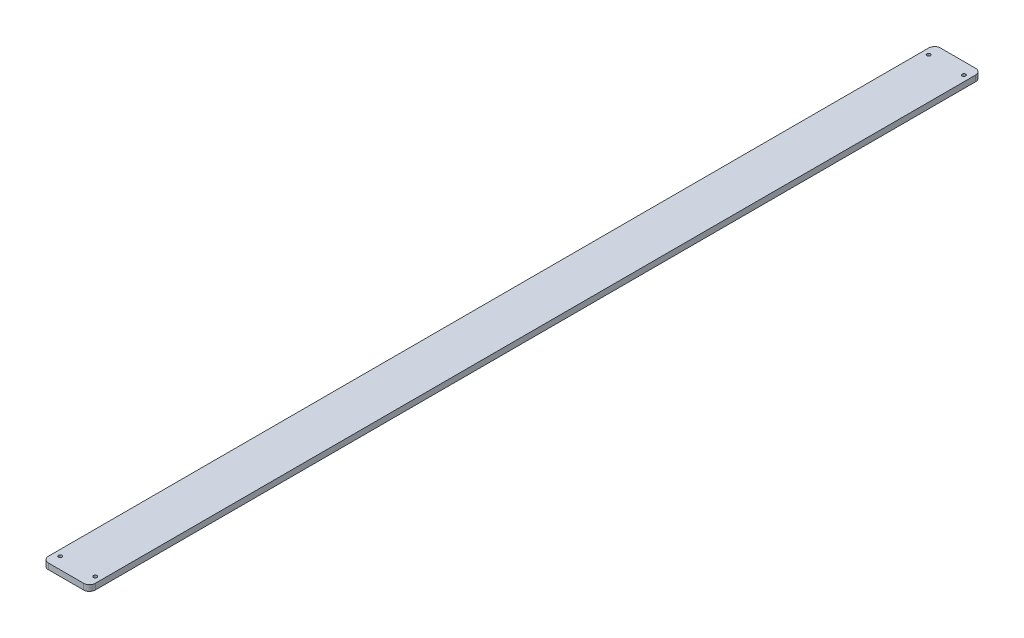
ISO-10303-21;
HEADER;
FILE_DESCRIPTION(('STEP AP214'),'2;1');
FILE_NAME('part.step','',(''),(''),'','','');
FILE_SCHEMA(('AUTOMOTIVE_DESIGN { 1 0 10303 214 1 1 1 1 }'));
ENDSEC;
DATA;
#1=APPLICATION_CONTEXT('core data for automotive mechanical design processes');
#2=APPLICATION_PROTOCOL_DEFINITION('international standard','automotive_design',2000,#1);
#3=PRODUCT_CONTEXT('',#1,'mechanical');
#4=PRODUCT('Part','Part','',(#3));
#5=PRODUCT_RELATED_PRODUCT_CATEGORY('part','',(#4));
#6=PRODUCT_DEFINITION_FORMATION('','',#4);
#7=PRODUCT_DEFINITION_CONTEXT('part definition',#1,'design');
#8=PRODUCT_DEFINITION('design','',#6,#7);
#9=PRODUCT_DEFINITION_SHAPE('','',#8);
#10=(LENGTH_UNIT() NAMED_UNIT(*) SI_UNIT(.MILLI.,.METRE.));
#11=(NAMED_UNIT(*) PLANE_ANGLE_UNIT() SI_UNIT($,.RADIAN.));
#12=(NAMED_UNIT(*) SI_UNIT($,.STERADIAN.) SOLID_ANGLE_UNIT());
#13=UNCERTAINTY_MEASURE_WITH_UNIT(LENGTH_MEASURE(1.E-05),#10,'distance_accuracy_value','');
#14=(GEOMETRIC_REPRESENTATION_CONTEXT(3) GLOBAL_UNCERTAINTY_ASSIGNED_CONTEXT((#13)) GLOBAL_UNIT_ASSIGNED_CONTEXT((#10,
#11,#12)) REPRESENTATION_CONTEXT('',''));
#15=CARTESIAN_POINT('',(0.,0.,0.));
#16=DIRECTION('',(0.,0.,1.));
#17=DIRECTION('',(1.,0.,0.));
#18=AXIS2_PLACEMENT_3D('',#15,#16,#17);
#19=CARTESIAN_POINT('',(0.,5.,0.));
#20=DIRECTION('',(0.,-1.,0.));
#21=DIRECTION('',(0.,0.,-1.));
#22=AXIS2_PLACEMENT_3D('',#19,#20,#21);
#23=PLANE('',#22);
#24=DIRECTION('',(-1.,0.,0.));
#25=VECTOR('',#24,1.);
#26=CARTESIAN_POINT('',(-20.,5.,-380.5));
#27=LINE('',#26,#25);
#28=CARTESIAN_POINT('',(15.,5.,-380.5));
#29=VERTEX_POINT('',#28);
#30=CARTESIAN_POINT('',(-15.,5.,-380.5));
#31=VERTEX_POINT('',#30);
#32=EDGE_CURVE('E170',#29,#31,#27,.T.);
#33=ORIENTED_EDGE('',*,*,#32,.T.);
#34=CARTESIAN_POINT('',(-15.,5.,-375.5));
#35=DIRECTION('',(0.,-1.,0.));
#36=DIRECTION('',(0.,0.,-1.));
#37=AXIS2_PLACEMENT_3D('',#34,#35,#36);
#38=CIRCLE('',#37,5.);
#39=CARTESIAN_POINT('',(-20.,5.,-375.5));
#40=VERTEX_POINT('',#39);
#41=EDGE_CURVE('E150',#31,#40,#38,.F.);
#42=ORIENTED_EDGE('',*,*,#41,.T.);
#43=DIRECTION('',(0.,0.,1.));
#44=VECTOR('',#43,1.);
#45=CARTESIAN_POINT('',(-19.9999999999998,5.,380.5));
#46=LINE('',#45,#44);
#47=CARTESIAN_POINT('',(-19.9999999999998,5.,375.5));
#48=VERTEX_POINT('',#47);
#49=EDGE_CURVE('E120',#40,#48,#46,.T.);
#50=ORIENTED_EDGE('',*,*,#49,.T.);
#51=CARTESIAN_POINT('',(-14.9999999999998,5.,375.5));
#52=DIRECTION('',(0.,-1.,0.));
#53=DIRECTION('',(0.,0.,-1.));
#54=AXIS2_PLACEMENT_3D('',#51,#52,#53);
#55=CIRCLE('',#54,5.);
#56=CARTESIAN_POINT('',(-14.9999999999998,5.,380.5));
#57=VERTEX_POINT('',#56);
#58=EDGE_CURVE('E56',#48,#57,#55,.F.);
#59=ORIENTED_EDGE('',*,*,#58,.T.);
#60=DIRECTION('',(1.,0.,0.));
#61=VECTOR('',#60,1.);
#62=CARTESIAN_POINT('',(-19.9999999999998,5.,380.5));
#63=LINE('',#62,#61);
#64=CARTESIAN_POINT('',(15.,5.,380.5));
#65=VERTEX_POINT('',#64);
#66=EDGE_CURVE('E137',#57,#65,#63,.T.);
#67=ORIENTED_EDGE('',*,*,#66,.T.);
#68=CARTESIAN_POINT('',(15.,5.,375.5));
#69=DIRECTION('',(0.,-1.,0.));
#70=DIRECTION('',(0.,0.,-1.));
#71=AXIS2_PLACEMENT_3D('',#68,#69,#70);
#72=CIRCLE('',#71,5.);
#73=CARTESIAN_POINT('',(20.,5.,375.5));
#74=VERTEX_POINT('',#73);
#75=EDGE_CURVE('E145',#65,#74,#72,.F.);
#76=ORIENTED_EDGE('',*,*,#75,.T.);
#77=DIRECTION('',(0.,0.,-1.));
#78=VECTOR('',#77,1.);
#79=CARTESIAN_POINT('',(20.,5.,380.5));
#80=LINE('',#79,#78);
#81=CARTESIAN_POINT('',(20.,5.,-375.5));
#82=VERTEX_POINT('',#81);
#83=EDGE_CURVE('E131',#74,#82,#80,.T.);
#84=ORIENTED_EDGE('',*,*,#83,.T.);
#85=CARTESIAN_POINT('',(15.,5.,-375.5));
#86=DIRECTION('',(0.,-1.,0.));
#87=DIRECTION('',(0.,0.,-1.));
#88=AXIS2_PLACEMENT_3D('',#85,#86,#87);
#89=CIRCLE('',#88,5.);
#90=EDGE_CURVE('E148',#82,#29,#89,.F.);
#91=ORIENTED_EDGE('',*,*,#90,.T.);
#92=EDGE_LOOP('',(#33,#42,#50,#59,#67,#76,#84,#91));
#93=FACE_BOUND('',#92,.T.);
#94=CARTESIAN_POINT('',(15.,5.,-370.5));
#95=DIRECTION('',(0.,1.,0.));
#96=DIRECTION('',(0.,0.,1.));
#97=AXIS2_PLACEMENT_3D('',#94,#95,#96);
#98=CIRCLE('',#97,1.5);
#99=CARTESIAN_POINT('',(15.,5.,-369.));
#100=VERTEX_POINT('',#99);
#101=EDGE_CURVE('E176',#100,#100,#98,.T.);
#102=ORIENTED_EDGE('',*,*,#101,.F.);
#103=EDGE_LOOP('',(#102));
#104=FACE_BOUND('',#103,.T.);
#105=CARTESIAN_POINT('',(-15.,5.,-370.5));
#106=DIRECTION('',(0.,1.,0.));
#107=DIRECTION('',(0.,0.,-1.));
#108=AXIS2_PLACEMENT_3D('',#105,#106,#107);
#109=CIRCLE('',#108,1.5);
#110=CARTESIAN_POINT('',(-15.,5.,-372.));
#111=VERTEX_POINT('',#110);
#112=EDGE_CURVE('E185',#111,#111,#109,.T.);
#113=ORIENTED_EDGE('',*,*,#112,.F.);
#114=EDGE_LOOP('',(#113));
#115=FACE_BOUND('',#114,.T.);
#116=CARTESIAN_POINT('',(-15.,5.,370.5));
#117=DIRECTION('',(0.,1.,0.));
#118=DIRECTION('',(0.,0.,1.));
#119=AXIS2_PLACEMENT_3D('',#116,#117,#118);
#120=CIRCLE('',#119,1.5);
#121=CARTESIAN_POINT('',(-15.,5.,372.));
#122=VERTEX_POINT('',#121);
#123=EDGE_CURVE('E190',#122,#122,#120,.T.);
#124=ORIENTED_EDGE('',*,*,#123,.F.);
#125=EDGE_LOOP('',(#124));
#126=FACE_BOUND('',#125,.T.);
#127=CARTESIAN_POINT('',(15.,5.,370.5));
#128=DIRECTION('',(0.,1.,0.));
#129=DIRECTION('',(0.,0.,-1.));
#130=AXIS2_PLACEMENT_3D('',#127,#128,#129);
#131=CIRCLE('',#130,1.5);
#132=CARTESIAN_POINT('',(15.,5.,369.));
#133=VERTEX_POINT('',#132);
#134=EDGE_CURVE('E196',#133,#133,#131,.T.);
#135=ORIENTED_EDGE('',*,*,#134,.F.);
#136=EDGE_LOOP('',(#135));
#137=FACE_BOUND('',#136,.T.);
#138=ADVANCED_FACE('F35',(#93,#104,#115,#126,#137),#23,.F.);
#139=CARTESIAN_POINT('',(0.,0.,0.));
#140=DIRECTION('',(0.,-1.,0.));
#141=DIRECTION('',(0.,0.,-1.));
#142=AXIS2_PLACEMENT_3D('',#139,#140,#141);
#143=PLANE('',#142);
#144=CARTESIAN_POINT('',(-15.,0.,370.5));
#145=DIRECTION('',(0.,1.,0.));
#146=DIRECTION('',(0.,0.,1.));
#147=AXIS2_PLACEMENT_3D('',#144,#145,#146);
#148=CIRCLE('',#147,1.5);
#149=CARTESIAN_POINT('',(-15.,0.,372.));
#150=VERTEX_POINT('',#149);
#151=EDGE_CURVE('E193',#150,#150,#148,.T.);
#152=ORIENTED_EDGE('',*,*,#151,.T.);
#153=EDGE_LOOP('',(#152));
#154=FACE_BOUND('',#153,.T.);
#155=CARTESIAN_POINT('',(15.,0.,-370.5));
#156=DIRECTION('',(0.,1.,0.));
#157=DIRECTION('',(0.,0.,1.));
#158=AXIS2_PLACEMENT_3D('',#155,#156,#157);
#159=CIRCLE('',#158,1.5);
#160=CARTESIAN_POINT('',(15.,0.,-369.));
#161=VERTEX_POINT('',#160);
#162=EDGE_CURVE('E178',#161,#161,#159,.T.);
#163=ORIENTED_EDGE('',*,*,#162,.T.);
#164=EDGE_LOOP('',(#163));
#165=FACE_BOUND('',#164,.T.);
#166=DIRECTION('',(0.,0.,1.));
#167=VECTOR('',#166,1.);
#168=CARTESIAN_POINT('',(-19.9999999999998,0.,380.5));
#169=LINE('',#168,#167);
#170=CARTESIAN_POINT('',(-20.,0.,-375.5));
#171=VERTEX_POINT('',#170);
#172=CARTESIAN_POINT('',(-19.9999999999998,0.,375.5));
#173=VERTEX_POINT('',#172);
#174=EDGE_CURVE('E118',#171,#173,#169,.T.);
#175=ORIENTED_EDGE('',*,*,#174,.F.);
#176=CARTESIAN_POINT('',(-15.,0.,-375.5));
#177=DIRECTION('',(0.,-1.,0.));
#178=DIRECTION('',(0.,0.,-1.));
#179=AXIS2_PLACEMENT_3D('',#176,#177,#178);
#180=CIRCLE('',#179,5.);
#181=CARTESIAN_POINT('',(-15.,0.,-380.5));
#182=VERTEX_POINT('',#181);
#183=EDGE_CURVE('E101',#171,#182,#180,.T.);
#184=ORIENTED_EDGE('',*,*,#183,.T.);
#185=DIRECTION('',(-1.,0.,0.));
#186=VECTOR('',#185,1.);
#187=CARTESIAN_POINT('',(-20.,0.,-380.5));
#188=LINE('',#187,#186);
#189=CARTESIAN_POINT('',(15.,0.,-380.5));
#190=VERTEX_POINT('',#189);
#191=EDGE_CURVE('E129',#190,#182,#188,.T.);
#192=ORIENTED_EDGE('',*,*,#191,.F.);
#193=CARTESIAN_POINT('',(15.,0.,-375.5));
#194=DIRECTION('',(0.,-1.,0.));
#195=DIRECTION('',(0.,0.,-1.));
#196=AXIS2_PLACEMENT_3D('',#193,#194,#195);
#197=CIRCLE('',#196,5.);
#198=CARTESIAN_POINT('',(20.,0.,-375.5));
#199=VERTEX_POINT('',#198);
#200=EDGE_CURVE('E112',#190,#199,#197,.T.);
#201=ORIENTED_EDGE('',*,*,#200,.T.);
#202=DIRECTION('',(0.,0.,-1.));
#203=VECTOR('',#202,1.);
#204=CARTESIAN_POINT('',(20.,0.,380.5));
#205=LINE('',#204,#203);
#206=CARTESIAN_POINT('',(20.,0.,375.5));
#207=VERTEX_POINT('',#206);
#208=EDGE_CURVE('E133',#207,#199,#205,.T.);
#209=ORIENTED_EDGE('',*,*,#208,.F.);
#210=CARTESIAN_POINT('',(15.,0.,375.5));
#211=DIRECTION('',(0.,-1.,0.));
#212=DIRECTION('',(0.,0.,-1.));
#213=AXIS2_PLACEMENT_3D('',#210,#211,#212);
#214=CIRCLE('',#213,5.);
#215=CARTESIAN_POINT('',(15.,0.,380.5));
#216=VERTEX_POINT('',#215);
#217=EDGE_CURVE('E121',#207,#216,#214,.T.);
#218=ORIENTED_EDGE('',*,*,#217,.T.);
#219=DIRECTION('',(1.,0.,0.));
#220=VECTOR('',#219,1.);
#221=CARTESIAN_POINT('',(-19.9999999999998,0.,380.5));
#222=LINE('',#221,#220);
#223=CARTESIAN_POINT('',(-14.9999999999998,0.,380.5));
#224=VERTEX_POINT('',#223);
#225=EDGE_CURVE('E128',#224,#216,#222,.T.);
#226=ORIENTED_EDGE('',*,*,#225,.F.);
#227=CARTESIAN_POINT('',(-14.9999999999998,0.,375.5));
#228=DIRECTION('',(0.,-1.,0.));
#229=DIRECTION('',(0.,0.,-1.));
#230=AXIS2_PLACEMENT_3D('',#227,#228,#229);
#231=CIRCLE('',#230,5.);
#232=EDGE_CURVE('E127',#224,#173,#231,.T.);
#233=ORIENTED_EDGE('',*,*,#232,.T.);
#234=EDGE_LOOP('',(#175,#184,#192,#201,#209,#218,#226,#233));
#235=FACE_BOUND('',#234,.T.);
#236=CARTESIAN_POINT('',(-15.,0.,-370.5));
#237=DIRECTION('',(0.,1.,0.));
#238=DIRECTION('',(0.,0.,-1.));
#239=AXIS2_PLACEMENT_3D('',#236,#237,#238);
#240=CIRCLE('',#239,1.5);
#241=CARTESIAN_POINT('',(-15.,0.,-372.));
#242=VERTEX_POINT('',#241);
#243=EDGE_CURVE('E187',#242,#242,#240,.T.);
#244=ORIENTED_EDGE('',*,*,#243,.T.);
#245=EDGE_LOOP('',(#244));
#246=FACE_BOUND('',#245,.T.);
#247=CARTESIAN_POINT('',(15.,0.,370.5));
#248=DIRECTION('',(0.,1.,0.));
#249=DIRECTION('',(0.,0.,-1.));
#250=AXIS2_PLACEMENT_3D('',#247,#248,#249);
#251=CIRCLE('',#250,1.5);
#252=CARTESIAN_POINT('',(15.,0.,369.));
#253=VERTEX_POINT('',#252);
#254=EDGE_CURVE('E199',#253,#253,#251,.T.);
#255=ORIENTED_EDGE('',*,*,#254,.T.);
#256=EDGE_LOOP('',(#255));
#257=FACE_BOUND('',#256,.T.);
#258=ADVANCED_FACE('F124',(#154,#165,#235,#246,#257),#143,.T.);
#259=CARTESIAN_POINT('',(20.,5.,380.5));
#260=DIRECTION('',(-1.,0.,0.));
#261=DIRECTION('',(0.,0.,1.));
#262=AXIS2_PLACEMENT_3D('',#259,#260,#261);
#263=PLANE('',#262);
#264=ORIENTED_EDGE('',*,*,#208,.T.);
#265=DIRECTION('',(0.,-1.,0.));
#266=VECTOR('',#265,1.);
#267=CARTESIAN_POINT('',(20.,5.,-375.5));
#268=LINE('',#267,#266);
#269=EDGE_CURVE('E155',#199,#82,#268,.F.);
#270=ORIENTED_EDGE('',*,*,#269,.T.);
#271=ORIENTED_EDGE('',*,*,#83,.F.);
#272=DIRECTION('',(0.,-1.,0.));
#273=VECTOR('',#272,1.);
#274=CARTESIAN_POINT('',(20.,5.,375.5));
#275=LINE('',#274,#273);
#276=EDGE_CURVE('E152',#74,#207,#275,.T.);
#277=ORIENTED_EDGE('',*,*,#276,.T.);
#278=EDGE_LOOP('',(#264,#270,#271,#277));
#279=FACE_BOUND('',#278,.T.);
#280=ADVANCED_FACE('F161',(#279),#263,.F.);
#281=CARTESIAN_POINT('',(-20.,5.,-380.5));
#282=DIRECTION('',(0.,0.,1.));
#283=DIRECTION('',(1.,0.,0.));
#284=AXIS2_PLACEMENT_3D('',#281,#282,#283);
#285=PLANE('',#284);
#286=ORIENTED_EDGE('',*,*,#191,.T.);
#287=DIRECTION('',(0.,-1.,0.));
#288=VECTOR('',#287,1.);
#289=CARTESIAN_POINT('',(-15.,5.,-380.5));
#290=LINE('',#289,#288);
#291=EDGE_CURVE('E106',#182,#31,#290,.F.);
#292=ORIENTED_EDGE('',*,*,#291,.T.);
#293=ORIENTED_EDGE('',*,*,#32,.F.);
#294=DIRECTION('',(0.,-1.,0.));
#295=VECTOR('',#294,1.);
#296=CARTESIAN_POINT('',(15.,5.,-380.5));
#297=LINE('',#296,#295);
#298=EDGE_CURVE('E111',#29,#190,#297,.T.);
#299=ORIENTED_EDGE('',*,*,#298,.T.);
#300=EDGE_LOOP('',(#286,#292,#293,#299));
#301=FACE_BOUND('',#300,.T.);
#302=ADVANCED_FACE('F175',(#301),#285,.F.);
#303=CARTESIAN_POINT('',(-19.9999999999998,5.,380.5));
#304=DIRECTION('',(1.,0.,0.));
#305=DIRECTION('',(0.,0.,-1.));
#306=AXIS2_PLACEMENT_3D('',#303,#304,#305);
#307=PLANE('',#306);
#308=ORIENTED_EDGE('',*,*,#49,.F.);
#309=DIRECTION('',(0.,-1.,0.));
#310=VECTOR('',#309,1.);
#311=CARTESIAN_POINT('',(-20.,5.,-375.5));
#312=LINE('',#311,#310);
#313=EDGE_CURVE('E105',#40,#171,#312,.T.);
#314=ORIENTED_EDGE('',*,*,#313,.T.);
#315=ORIENTED_EDGE('',*,*,#174,.T.);
#316=DIRECTION('',(0.,-1.,0.));
#317=VECTOR('',#316,1.);
#318=CARTESIAN_POINT('',(-19.9999999999998,5.,375.5));
#319=LINE('',#318,#317);
#320=EDGE_CURVE('E122',#173,#48,#319,.F.);
#321=ORIENTED_EDGE('',*,*,#320,.T.);
#322=EDGE_LOOP('',(#308,#314,#315,#321));
#323=FACE_BOUND('',#322,.T.);
#324=ADVANCED_FACE('F117',(#323),#307,.F.);
#325=CARTESIAN_POINT('',(-19.9999999999998,5.,380.5));
#326=DIRECTION('',(0.,0.,-1.));
#327=DIRECTION('',(-1.,0.,0.));
#328=AXIS2_PLACEMENT_3D('',#325,#326,#327);
#329=PLANE('',#328);
#330=ORIENTED_EDGE('',*,*,#66,.F.);
#331=DIRECTION('',(0.,-1.,0.));
#332=VECTOR('',#331,1.);
#333=CARTESIAN_POINT('',(-14.9999999999998,5.,380.5));
#334=LINE('',#333,#332);
#335=EDGE_CURVE('E11',#57,#224,#334,.T.);
#336=ORIENTED_EDGE('',*,*,#335,.T.);
#337=ORIENTED_EDGE('',*,*,#225,.T.);
#338=DIRECTION('',(0.,-1.,0.));
#339=VECTOR('',#338,1.);
#340=CARTESIAN_POINT('',(15.,5.,380.5));
#341=LINE('',#340,#339);
#342=EDGE_CURVE('E43',#216,#65,#341,.F.);
#343=ORIENTED_EDGE('',*,*,#342,.T.);
#344=EDGE_LOOP('',(#330,#336,#337,#343));
#345=FACE_BOUND('',#344,.T.);
#346=ADVANCED_FACE('F219',(#345),#329,.F.);
#347=CARTESIAN_POINT('',(15.,5.,-370.5));
#348=DIRECTION('',(0.,-1.,0.));
#349=DIRECTION('',(0.,0.,-1.));
#350=AXIS2_PLACEMENT_3D('',#347,#348,#349);
#351=CYLINDRICAL_SURFACE('',#350,1.5);
#352=ORIENTED_EDGE('',*,*,#101,.T.);
#353=EDGE_LOOP('',(#352));
#354=FACE_BOUND('',#353,.T.);
#355=ORIENTED_EDGE('',*,*,#162,.F.);
#356=EDGE_LOOP('',(#355));
#357=FACE_BOUND('',#356,.T.);
#358=ADVANCED_FACE('F216',(#354,#357),#351,.F.);
#359=CARTESIAN_POINT('',(-15.,5.,-370.5));
#360=DIRECTION('',(0.,-1.,0.));
#361=DIRECTION('',(0.,0.,-1.));
#362=AXIS2_PLACEMENT_3D('',#359,#360,#361);
#363=CYLINDRICAL_SURFACE('',#362,1.5);
#364=ORIENTED_EDGE('',*,*,#112,.T.);
#365=EDGE_LOOP('',(#364));
#366=FACE_BOUND('',#365,.T.);
#367=ORIENTED_EDGE('',*,*,#243,.F.);
#368=EDGE_LOOP('',(#367));
#369=FACE_BOUND('',#368,.T.);
#370=ADVANCED_FACE('F311',(#366,#369),#363,.F.);
#371=CARTESIAN_POINT('',(-15.,5.,370.5));
#372=DIRECTION('',(0.,-1.,0.));
#373=DIRECTION('',(0.,0.,-1.));
#374=AXIS2_PLACEMENT_3D('',#371,#372,#373);
#375=CYLINDRICAL_SURFACE('',#374,1.5);
#376=ORIENTED_EDGE('',*,*,#123,.T.);
#377=EDGE_LOOP('',(#376));
#378=FACE_BOUND('',#377,.T.);
#379=ORIENTED_EDGE('',*,*,#151,.F.);
#380=EDGE_LOOP('',(#379));
#381=FACE_BOUND('',#380,.T.);
#382=ADVANCED_FACE('F302',(#378,#381),#375,.F.);
#383=CARTESIAN_POINT('',(15.,5.,370.5));
#384=DIRECTION('',(0.,-1.,0.));
#385=DIRECTION('',(0.,0.,-1.));
#386=AXIS2_PLACEMENT_3D('',#383,#384,#385);
#387=CYLINDRICAL_SURFACE('',#386,1.5);
#388=ORIENTED_EDGE('',*,*,#134,.T.);
#389=EDGE_LOOP('',(#388));
#390=FACE_BOUND('',#389,.T.);
#391=ORIENTED_EDGE('',*,*,#254,.F.);
#392=EDGE_LOOP('',(#391));
#393=FACE_BOUND('',#392,.T.);
#394=ADVANCED_FACE('F205',(#390,#393),#387,.F.);
#395=CARTESIAN_POINT('',(-15.,5.,-375.5));
#396=DIRECTION('',(0.,-1.,0.));
#397=DIRECTION('',(0.,0.,-1.));
#398=AXIS2_PLACEMENT_3D('',#395,#396,#397);
#399=CYLINDRICAL_SURFACE('',#398,5.);
#400=ORIENTED_EDGE('',*,*,#41,.F.);
#401=ORIENTED_EDGE('',*,*,#291,.F.);
#402=ORIENTED_EDGE('',*,*,#183,.F.);
#403=ORIENTED_EDGE('',*,*,#313,.F.);
#404=EDGE_LOOP('',(#400,#401,#402,#403));
#405=FACE_BOUND('',#404,.T.);
#406=ADVANCED_FACE('F104',(#405),#399,.T.);
#407=CARTESIAN_POINT('',(15.,5.,-375.5));
#408=DIRECTION('',(0.,-1.,0.));
#409=DIRECTION('',(0.,0.,-1.));
#410=AXIS2_PLACEMENT_3D('',#407,#408,#409);
#411=CYLINDRICAL_SURFACE('',#410,5.);
#412=ORIENTED_EDGE('',*,*,#90,.F.);
#413=ORIENTED_EDGE('',*,*,#269,.F.);
#414=ORIENTED_EDGE('',*,*,#200,.F.);
#415=ORIENTED_EDGE('',*,*,#298,.F.);
#416=EDGE_LOOP('',(#412,#413,#414,#415));
#417=FACE_BOUND('',#416,.T.);
#418=ADVANCED_FACE('F173',(#417),#411,.T.);
#419=CARTESIAN_POINT('',(-14.9999999999998,5.,375.5));
#420=DIRECTION('',(0.,-1.,0.));
#421=DIRECTION('',(0.,0.,-1.));
#422=AXIS2_PLACEMENT_3D('',#419,#420,#421);
#423=CYLINDRICAL_SURFACE('',#422,5.);
#424=ORIENTED_EDGE('',*,*,#58,.F.);
#425=ORIENTED_EDGE('',*,*,#320,.F.);
#426=ORIENTED_EDGE('',*,*,#232,.F.);
#427=ORIENTED_EDGE('',*,*,#335,.F.);
#428=EDGE_LOOP('',(#424,#425,#426,#427));
#429=FACE_BOUND('',#428,.T.);
#430=ADVANCED_FACE('F231',(#429),#423,.T.);
#431=CARTESIAN_POINT('',(15.,5.,375.5));
#432=DIRECTION('',(0.,-1.,0.));
#433=DIRECTION('',(0.,0.,-1.));
#434=AXIS2_PLACEMENT_3D('',#431,#432,#433);
#435=CYLINDRICAL_SURFACE('',#434,5.);
#436=ORIENTED_EDGE('',*,*,#75,.F.);
#437=ORIENTED_EDGE('',*,*,#342,.F.);
#438=ORIENTED_EDGE('',*,*,#217,.F.);
#439=ORIENTED_EDGE('',*,*,#276,.F.);
#440=EDGE_LOOP('',(#436,#437,#438,#439));
#441=FACE_BOUND('',#440,.T.);
#442=ADVANCED_FACE('F37',(#441),#435,.T.);
#443=CLOSED_SHELL('',(#138,#258,#280,#302,#324,#346,#358,#370,#382,#394,#406,#418,#430,#442));
#444=MANIFOLD_SOLID_BREP('B2',#443);
#445=ADVANCED_BREP_SHAPE_REPRESENTATION('',(#18,#444),#14);
#446=SHAPE_DEFINITION_REPRESENTATION(#9,#445);
ENDSEC;
END-ISO-10303-21;
